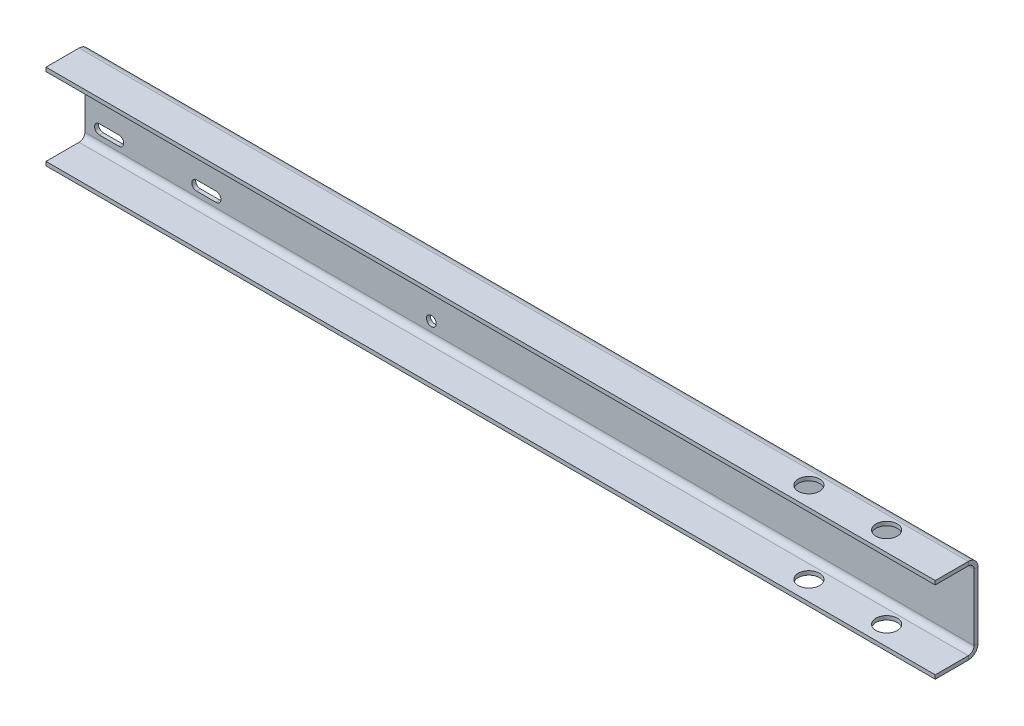
ISO-10303-21;
HEADER;
FILE_DESCRIPTION(('STEP AP214'),'2;1');
FILE_NAME('part.step','',(''),(''),'','','');
FILE_SCHEMA(('AUTOMOTIVE_DESIGN { 1 0 10303 214 1 1 1 1 }'));
ENDSEC;
DATA;
#1=APPLICATION_CONTEXT('core data for automotive mechanical design processes');
#2=APPLICATION_PROTOCOL_DEFINITION('international standard','automotive_design',2000,#1);
#3=PRODUCT_CONTEXT('',#1,'mechanical');
#4=PRODUCT('Part','Part','',(#3));
#5=PRODUCT_RELATED_PRODUCT_CATEGORY('part','',(#4));
#6=PRODUCT_DEFINITION_FORMATION('','',#4);
#7=PRODUCT_DEFINITION_CONTEXT('part definition',#1,'design');
#8=PRODUCT_DEFINITION('design','',#6,#7);
#9=PRODUCT_DEFINITION_SHAPE('','',#8);
#10=(LENGTH_UNIT() NAMED_UNIT(*) SI_UNIT(.MILLI.,.METRE.));
#11=(NAMED_UNIT(*) PLANE_ANGLE_UNIT() SI_UNIT($,.RADIAN.));
#12=(NAMED_UNIT(*) SI_UNIT($,.STERADIAN.) SOLID_ANGLE_UNIT());
#13=UNCERTAINTY_MEASURE_WITH_UNIT(LENGTH_MEASURE(1.E-05),#10,'distance_accuracy_value','');
#14=(GEOMETRIC_REPRESENTATION_CONTEXT(3) GLOBAL_UNCERTAINTY_ASSIGNED_CONTEXT((#13)) GLOBAL_UNIT_ASSIGNED_CONTEXT((#10,
#11,#12)) REPRESENTATION_CONTEXT('',''));
#15=CARTESIAN_POINT('',(0.,0.,0.));
#16=DIRECTION('',(0.,0.,1.));
#17=DIRECTION('',(1.,0.,0.));
#18=AXIS2_PLACEMENT_3D('',#15,#16,#17);
#19=CARTESIAN_POINT('',(0.,0.,-4.));
#20=DIRECTION('',(0.,0.,-1.));
#21=DIRECTION('',(-1.,0.,0.));
#22=AXIS2_PLACEMENT_3D('',#19,#20,#21);
#23=PLANE('',#22);
#24=CARTESIAN_POINT('',(-509.018987341773,19.9999999999998,-4.));
#25=DIRECTION('',(0.,0.,-1.));
#26=DIRECTION('',(-1.,0.,0.));
#27=AXIS2_PLACEMENT_3D('',#24,#25,#26);
#28=CIRCLE('',#27,5.00000000000004);
#29=CARTESIAN_POINT('',(-514.018987341773,19.9999999999998,-4.));
#30=VERTEX_POINT('',#29);
#31=EDGE_CURVE('E880',#30,#30,#28,.T.);
#32=ORIENTED_EDGE('',*,*,#31,.F.);
#33=EDGE_LOOP('',(#32));
#34=FACE_BOUND('',#33,.T.);
#35=CARTESIAN_POINT('',(-750.518987341773,19.9999999999999,-4.));
#36=DIRECTION('',(0.,0.,-1.));
#37=DIRECTION('',(-1.,0.,0.));
#38=AXIS2_PLACEMENT_3D('',#35,#36,#37);
#39=CIRCLE('',#38,5.);
#40=CARTESIAN_POINT('',(-750.518987341773,14.9999999999999,-4.));
#41=VERTEX_POINT('',#40);
#42=CARTESIAN_POINT('',(-750.518987341773,24.9999999999999,-4.));
#43=VERTEX_POINT('',#42);
#44=EDGE_CURVE('E97',#41,#43,#39,.T.);
#45=ORIENTED_EDGE('',*,*,#44,.F.);
#46=DIRECTION('',(-1.,0.,0.));
#47=VECTOR('',#46,1.);
#48=CARTESIAN_POINT('',(-750.518987341773,14.9999999999999,-4.));
#49=LINE('',#48,#47);
#50=CARTESIAN_POINT('',(-730.518987341773,14.9999999999999,-4.));
#51=VERTEX_POINT('',#50);
#52=EDGE_CURVE('E237',#51,#41,#49,.T.);
#53=ORIENTED_EDGE('',*,*,#52,.F.);
#54=CARTESIAN_POINT('',(-730.518987341773,19.9999999999999,-4.));
#55=DIRECTION('',(0.,0.,-1.));
#56=DIRECTION('',(-1.,0.,0.));
#57=AXIS2_PLACEMENT_3D('',#54,#55,#56);
#58=CIRCLE('',#57,5.);
#59=CARTESIAN_POINT('',(-730.518987341773,24.9999999999999,-4.));
#60=VERTEX_POINT('',#59);
#61=EDGE_CURVE('E222',#60,#51,#58,.T.);
#62=ORIENTED_EDGE('',*,*,#61,.F.);
#63=DIRECTION('',(1.,0.,0.));
#64=VECTOR('',#63,1.);
#65=CARTESIAN_POINT('',(-750.518987341773,24.9999999999999,-4.));
#66=LINE('',#65,#64);
#67=EDGE_CURVE('E231',#43,#60,#66,.T.);
#68=ORIENTED_EDGE('',*,*,#67,.F.);
#69=EDGE_LOOP('',(#45,#53,#62,#68));
#70=FACE_BOUND('',#69,.T.);
#71=CARTESIAN_POINT('',(-850.518987341773,19.9999999999999,-4.));
#72=DIRECTION('',(0.,0.,-1.));
#73=DIRECTION('',(-1.,0.,0.));
#74=AXIS2_PLACEMENT_3D('',#71,#72,#73);
#75=CIRCLE('',#74,5.);
#76=CARTESIAN_POINT('',(-850.518987341773,14.9999999999999,-4.));
#77=VERTEX_POINT('',#76);
#78=CARTESIAN_POINT('',(-850.518987341773,24.9999999999999,-4.));
#79=VERTEX_POINT('',#78);
#80=EDGE_CURVE('E244',#77,#79,#75,.T.);
#81=ORIENTED_EDGE('',*,*,#80,.F.);
#82=DIRECTION('',(-1.,0.,0.));
#83=VECTOR('',#82,1.);
#84=CARTESIAN_POINT('',(-850.518987341773,14.9999999999999,-4.));
#85=LINE('',#84,#83);
#86=CARTESIAN_POINT('',(-830.518987341773,14.9999999999999,-4.));
#87=VERTEX_POINT('',#86);
#88=EDGE_CURVE('E254',#87,#77,#85,.T.);
#89=ORIENTED_EDGE('',*,*,#88,.F.);
#90=CARTESIAN_POINT('',(-830.518987341773,19.9999999999999,-4.));
#91=DIRECTION('',(0.,0.,-1.));
#92=DIRECTION('',(-1.,0.,0.));
#93=AXIS2_PLACEMENT_3D('',#90,#91,#92);
#94=CIRCLE('',#93,5.);
#95=CARTESIAN_POINT('',(-830.518987341773,24.9999999999999,-4.));
#96=VERTEX_POINT('',#95);
#97=EDGE_CURVE('E251',#96,#87,#94,.T.);
#98=ORIENTED_EDGE('',*,*,#97,.F.);
#99=DIRECTION('',(1.,0.,0.));
#100=VECTOR('',#99,1.);
#101=CARTESIAN_POINT('',(-850.518987341773,24.9999999999999,-4.));
#102=LINE('',#101,#100);
#103=EDGE_CURVE('E248',#79,#96,#102,.T.);
#104=ORIENTED_EDGE('',*,*,#103,.F.);
#105=EDGE_LOOP('',(#81,#89,#98,#104));
#106=FACE_BOUND('',#105,.T.);
#107=DIRECTION('',(0.,1.,0.));
#108=VECTOR('',#107,1.);
#109=CARTESIAN_POINT('',(49.4810126582273,88.0000000000001,-4.));
#110=LINE('',#109,#108);
#111=CARTESIAN_POINT('',(49.4810126582273,10.,-4.00000000000004));
#112=VERTEX_POINT('',#111);
#113=CARTESIAN_POINT('',(49.4810126582273,78.,-4.));
#114=VERTEX_POINT('',#113);
#115=EDGE_CURVE('E398',#112,#114,#110,.T.);
#116=ORIENTED_EDGE('',*,*,#115,.F.);
#117=DIRECTION('',(1.,0.,0.));
#118=VECTOR('',#117,1.);
#119=CARTESIAN_POINT('',(49.4810126582273,10.,-4.00000000000004));
#120=LINE('',#119,#118);
#121=CARTESIAN_POINT('',(-865.518987341773,10.,-4.));
#122=VERTEX_POINT('',#121);
#123=EDGE_CURVE('E319',#112,#122,#120,.F.);
#124=ORIENTED_EDGE('',*,*,#123,.T.);
#125=DIRECTION('',(0.,-1.,0.));
#126=VECTOR('',#125,1.);
#127=CARTESIAN_POINT('',(-865.518987341773,88.,-4.));
#128=LINE('',#127,#126);
#129=CARTESIAN_POINT('',(-865.518987341773,78.,-4.00000000000008));
#130=VERTEX_POINT('',#129);
#131=EDGE_CURVE('E400',#130,#122,#128,.T.);
#132=ORIENTED_EDGE('',*,*,#131,.F.);
#133=DIRECTION('',(-1.,0.,0.));
#134=VECTOR('',#133,1.);
#135=CARTESIAN_POINT('',(-865.518987341773,78.,-4.00000000000008));
#136=LINE('',#135,#134);
#137=EDGE_CURVE('E374',#130,#114,#136,.F.);
#138=ORIENTED_EDGE('',*,*,#137,.T.);
#139=EDGE_LOOP('',(#116,#124,#132,#138));
#140=FACE_BOUND('',#139,.T.);
#141=ADVANCED_FACE('F81',(#34,#70,#106,#140),#23,.T.);
#142=CARTESIAN_POINT('',(0.,0.,0.));
#143=DIRECTION('',(0.,0.,-1.));
#144=DIRECTION('',(-1.,0.,0.));
#145=AXIS2_PLACEMENT_3D('',#142,#143,#144);
#146=PLANE('',#145);
#147=CARTESIAN_POINT('',(-509.018987341773,19.9999999999998,0.));
#148=DIRECTION('',(0.,0.,-1.));
#149=DIRECTION('',(-1.,0.,0.));
#150=AXIS2_PLACEMENT_3D('',#147,#148,#149);
#151=CIRCLE('',#150,5.00000000000004);
#152=CARTESIAN_POINT('',(-514.018987341773,19.9999999999998,0.));
#153=VERTEX_POINT('',#152);
#154=EDGE_CURVE('E85',#153,#153,#151,.T.);
#155=ORIENTED_EDGE('',*,*,#154,.T.);
#156=EDGE_LOOP('',(#155));
#157=FACE_BOUND('',#156,.T.);
#158=DIRECTION('',(-1.,0.,0.));
#159=VECTOR('',#158,1.);
#160=CARTESIAN_POINT('',(0.,14.9999999999999,0.));
#161=LINE('',#160,#159);
#162=CARTESIAN_POINT('',(-730.518987341773,14.9999999999999,0.));
#163=VERTEX_POINT('',#162);
#164=CARTESIAN_POINT('',(-750.518987341773,14.9999999999999,0.));
#165=VERTEX_POINT('',#164);
#166=EDGE_CURVE('E90',#163,#165,#161,.T.);
#167=ORIENTED_EDGE('',*,*,#166,.T.);
#168=CARTESIAN_POINT('',(-750.518987341773,19.9999999999999,0.));
#169=DIRECTION('',(0.,0.,-1.));
#170=DIRECTION('',(-1.,0.,0.));
#171=AXIS2_PLACEMENT_3D('',#168,#169,#170);
#172=CIRCLE('',#171,5.);
#173=CARTESIAN_POINT('',(-750.518987341773,24.9999999999999,0.));
#174=VERTEX_POINT('',#173);
#175=EDGE_CURVE('E13',#165,#174,#172,.T.);
#176=ORIENTED_EDGE('',*,*,#175,.T.);
#177=DIRECTION('',(1.,0.,0.));
#178=VECTOR('',#177,1.);
#179=CARTESIAN_POINT('',(0.,24.9999999999999,0.));
#180=LINE('',#179,#178);
#181=CARTESIAN_POINT('',(-730.518987341773,24.9999999999999,0.));
#182=VERTEX_POINT('',#181);
#183=EDGE_CURVE('E423',#174,#182,#180,.T.);
#184=ORIENTED_EDGE('',*,*,#183,.T.);
#185=CARTESIAN_POINT('',(-730.518987341773,19.9999999999999,0.));
#186=DIRECTION('',(0.,0.,-1.));
#187=DIRECTION('',(-1.,0.,0.));
#188=AXIS2_PLACEMENT_3D('',#185,#186,#187);
#189=CIRCLE('',#188,5.);
#190=EDGE_CURVE('E225',#182,#163,#189,.T.);
#191=ORIENTED_EDGE('',*,*,#190,.T.);
#192=EDGE_LOOP('',(#167,#176,#184,#191));
#193=FACE_BOUND('',#192,.T.);
#194=DIRECTION('',(-1.,0.,0.));
#195=VECTOR('',#194,1.);
#196=CARTESIAN_POINT('',(0.,14.9999999999999,0.));
#197=LINE('',#196,#195);
#198=CARTESIAN_POINT('',(-830.518987341773,14.9999999999999,0.));
#199=VERTEX_POINT('',#198);
#200=CARTESIAN_POINT('',(-850.518987341773,14.9999999999999,0.));
#201=VERTEX_POINT('',#200);
#202=EDGE_CURVE('E417',#199,#201,#197,.T.);
#203=ORIENTED_EDGE('',*,*,#202,.T.);
#204=CARTESIAN_POINT('',(-850.518987341773,19.9999999999999,0.));
#205=DIRECTION('',(0.,0.,-1.));
#206=DIRECTION('',(-1.,0.,0.));
#207=AXIS2_PLACEMENT_3D('',#204,#205,#206);
#208=CIRCLE('',#207,5.);
#209=CARTESIAN_POINT('',(-850.518987341773,24.9999999999999,0.));
#210=VERTEX_POINT('',#209);
#211=EDGE_CURVE('E420',#201,#210,#208,.T.);
#212=ORIENTED_EDGE('',*,*,#211,.T.);
#213=DIRECTION('',(1.,0.,0.));
#214=VECTOR('',#213,1.);
#215=CARTESIAN_POINT('',(0.,24.9999999999999,0.));
#216=LINE('',#215,#214);
#217=CARTESIAN_POINT('',(-830.518987341773,24.9999999999999,0.));
#218=VERTEX_POINT('',#217);
#219=EDGE_CURVE('E404',#210,#218,#216,.T.);
#220=ORIENTED_EDGE('',*,*,#219,.T.);
#221=CARTESIAN_POINT('',(-830.518987341773,19.9999999999999,0.));
#222=DIRECTION('',(0.,0.,-1.));
#223=DIRECTION('',(-1.,0.,0.));
#224=AXIS2_PLACEMENT_3D('',#221,#222,#223);
#225=CIRCLE('',#224,5.);
#226=EDGE_CURVE('E414',#218,#199,#225,.T.);
#227=ORIENTED_EDGE('',*,*,#226,.T.);
#228=EDGE_LOOP('',(#203,#212,#220,#227));
#229=FACE_BOUND('',#228,.T.);
#230=DIRECTION('',(1.,0.,0.));
#231=VECTOR('',#230,1.);
#232=CARTESIAN_POINT('',(49.4810126582273,9.99999999999998,0.));
#233=LINE('',#232,#231);
#234=CARTESIAN_POINT('',(49.4810126582273,9.99999999999998,0.));
#235=VERTEX_POINT('',#234);
#236=CARTESIAN_POINT('',(-865.518987341773,9.99999999999998,0.));
#237=VERTEX_POINT('',#236);
#238=EDGE_CURVE('E332',#235,#237,#233,.F.);
#239=ORIENTED_EDGE('',*,*,#238,.F.);
#240=DIRECTION('',(0.,1.,0.));
#241=VECTOR('',#240,1.);
#242=CARTESIAN_POINT('',(49.4810126582273,88.0000000000001,0.));
#243=LINE('',#242,#241);
#244=CARTESIAN_POINT('',(49.4810126582273,78.,0.));
#245=VERTEX_POINT('',#244);
#246=EDGE_CURVE('E395',#235,#245,#243,.T.);
#247=ORIENTED_EDGE('',*,*,#246,.T.);
#248=DIRECTION('',(-1.,0.,0.));
#249=VECTOR('',#248,1.);
#250=CARTESIAN_POINT('',(-865.518987341773,78.,0.));
#251=LINE('',#250,#249);
#252=CARTESIAN_POINT('',(-865.518987341773,78.,0.));
#253=VERTEX_POINT('',#252);
#254=EDGE_CURVE('E387',#253,#245,#251,.F.);
#255=ORIENTED_EDGE('',*,*,#254,.F.);
#256=DIRECTION('',(0.,-1.,0.));
#257=VECTOR('',#256,1.);
#258=CARTESIAN_POINT('',(-865.518987341773,88.,0.));
#259=LINE('',#258,#257);
#260=EDGE_CURVE('E401',#253,#237,#259,.T.);
#261=ORIENTED_EDGE('',*,*,#260,.T.);
#262=EDGE_LOOP('',(#239,#247,#255,#261));
#263=FACE_BOUND('',#262,.T.);
#264=ADVANCED_FACE('F428',(#157,#193,#229,#263),#146,.F.);
#265=CARTESIAN_POINT('',(49.4810126582273,88.0000000000001,-4.));
#266=DIRECTION('',(1.,0.,0.));
#267=DIRECTION('',(0.,0.,-1.));
#268=AXIS2_PLACEMENT_3D('',#265,#266,#267);
#269=PLANE('',#268);
#270=ORIENTED_EDGE('',*,*,#246,.F.);
#271=DIRECTION('',(0.,0.,-1.));
#272=VECTOR('',#271,1.);
#273=CARTESIAN_POINT('',(49.4810126582273,9.99999999999998,0.));
#274=LINE('',#273,#272);
#275=EDGE_CURVE('E326',#235,#112,#274,.T.);
#276=ORIENTED_EDGE('',*,*,#275,.T.);
#277=ORIENTED_EDGE('',*,*,#115,.T.);
#278=DIRECTION('',(0.,0.,-1.));
#279=VECTOR('',#278,1.);
#280=CARTESIAN_POINT('',(49.4810126582273,78.,0.));
#281=LINE('',#280,#279);
#282=EDGE_CURVE('E392',#245,#114,#281,.T.);
#283=ORIENTED_EDGE('',*,*,#282,.F.);
#284=EDGE_LOOP('',(#270,#276,#277,#283));
#285=FACE_BOUND('',#284,.T.);
#286=ADVANCED_FACE('F83',(#285),#269,.T.);
#287=CARTESIAN_POINT('',(-865.518987341773,88.,-4.));
#288=DIRECTION('',(-1.,0.,0.));
#289=DIRECTION('',(0.,0.,1.));
#290=AXIS2_PLACEMENT_3D('',#287,#288,#289);
#291=PLANE('',#290);
#292=DIRECTION('',(0.,0.,-1.));
#293=VECTOR('',#292,1.);
#294=CARTESIAN_POINT('',(-865.518987341773,9.99999999999998,0.));
#295=LINE('',#294,#293);
#296=EDGE_CURVE('E336',#237,#122,#295,.T.);
#297=ORIENTED_EDGE('',*,*,#296,.F.);
#298=ORIENTED_EDGE('',*,*,#260,.F.);
#299=DIRECTION('',(0.,0.,-1.));
#300=VECTOR('',#299,1.);
#301=CARTESIAN_POINT('',(-865.518987341773,78.,0.));
#302=LINE('',#301,#300);
#303=EDGE_CURVE('E381',#253,#130,#302,.T.);
#304=ORIENTED_EDGE('',*,*,#303,.T.);
#305=ORIENTED_EDGE('',*,*,#131,.T.);
#306=EDGE_LOOP('',(#297,#298,#304,#305));
#307=FACE_BOUND('',#306,.T.);
#308=ADVANCED_FACE('F459',(#307),#291,.T.);
#309=CARTESIAN_POINT('',(49.4810126582273,78.0000000000001,5.99999999999999));
#310=DIRECTION('',(1.,0.,0.));
#311=DIRECTION('',(0.,0.,-1.));
#312=AXIS2_PLACEMENT_3D('',#309,#310,#311);
#313=PLANE('',#312);
#314=DIRECTION('',(0.,1.,0.));
#315=VECTOR('',#314,1.);
#316=CARTESIAN_POINT('',(49.4810126582273,88.0000000000001,5.99999999999996));
#317=LINE('',#316,#315);
#318=CARTESIAN_POINT('',(49.4810126582273,84.0000000000001,5.99999999999997));
#319=VERTEX_POINT('',#318);
#320=CARTESIAN_POINT('',(49.4810126582273,88.0000000000001,5.99999999999995));
#321=VERTEX_POINT('',#320);
#322=EDGE_CURVE('E339',#319,#321,#317,.T.);
#323=ORIENTED_EDGE('',*,*,#322,.F.);
#324=CARTESIAN_POINT('',(49.4810126582273,78.0000000000001,5.99999999999999));
#325=DIRECTION('',(-1.,0.,0.));
#326=DIRECTION('',(0.,0.,1.));
#327=AXIS2_PLACEMENT_3D('',#324,#325,#326);
#328=CIRCLE('',#327,6.00000000000007);
#329=EDGE_CURVE('E384',#245,#319,#328,.F.);
#330=ORIENTED_EDGE('',*,*,#329,.F.);
#331=ORIENTED_EDGE('',*,*,#282,.T.);
#332=CARTESIAN_POINT('',(49.4810126582273,78.0000000000001,5.99999999999999));
#333=DIRECTION('',(-1.,0.,0.));
#334=DIRECTION('',(0.,0.,1.));
#335=AXIS2_PLACEMENT_3D('',#332,#333,#334);
#336=CIRCLE('',#335,10.0000000000001);
#337=EDGE_CURVE('E377',#114,#321,#336,.F.);
#338=ORIENTED_EDGE('',*,*,#337,.T.);
#339=EDGE_LOOP('',(#323,#330,#331,#338));
#340=FACE_BOUND('',#339,.T.);
#341=ADVANCED_FACE('F461',(#340),#313,.T.);
#342=CARTESIAN_POINT('',(-865.518987341773,78.0000000000001,5.99999999999999));
#343=DIRECTION('',(1.,0.,0.));
#344=DIRECTION('',(0.,0.,-1.));
#345=AXIS2_PLACEMENT_3D('',#342,#343,#344);
#346=PLANE('',#345);
#347=CARTESIAN_POINT('',(-865.518987341773,78.0000000000001,5.99999999999999));
#348=DIRECTION('',(-1.,0.,0.));
#349=DIRECTION('',(0.,0.,1.));
#350=AXIS2_PLACEMENT_3D('',#347,#348,#349);
#351=CIRCLE('',#350,6.00000000000007);
#352=CARTESIAN_POINT('',(-865.518987341773,84.0000000000001,5.99999999999997));
#353=VERTEX_POINT('',#352);
#354=EDGE_CURVE('E344',#353,#253,#351,.T.);
#355=ORIENTED_EDGE('',*,*,#354,.F.);
#356=DIRECTION('',(0.,1.,0.));
#357=VECTOR('',#356,1.);
#358=CARTESIAN_POINT('',(-865.518987341773,84.,5.99999999999996));
#359=LINE('',#358,#357);
#360=CARTESIAN_POINT('',(-865.518987341773,88.,5.99999999999995));
#361=VERTEX_POINT('',#360);
#362=EDGE_CURVE('E367',#353,#361,#359,.T.);
#363=ORIENTED_EDGE('',*,*,#362,.T.);
#364=CARTESIAN_POINT('',(-865.518987341773,78.0000000000001,5.99999999999999));
#365=DIRECTION('',(-1.,0.,0.));
#366=DIRECTION('',(0.,0.,1.));
#367=AXIS2_PLACEMENT_3D('',#364,#365,#366);
#368=CIRCLE('',#367,10.0000000000001);
#369=EDGE_CURVE('E378',#361,#130,#368,.T.);
#370=ORIENTED_EDGE('',*,*,#369,.T.);
#371=ORIENTED_EDGE('',*,*,#303,.F.);
#372=EDGE_LOOP('',(#355,#363,#370,#371));
#373=FACE_BOUND('',#372,.T.);
#374=ADVANCED_FACE('F457',(#373),#346,.F.);
#375=CARTESIAN_POINT('',(-865.518987341773,78.0000000000001,5.99999999999999));
#376=DIRECTION('',(-1.,0.,0.));
#377=DIRECTION('',(0.,1.,0.));
#378=AXIS2_PLACEMENT_3D('',#375,#376,#377);
#379=CYLINDRICAL_SURFACE('',#378,10.0000000000001);
#380=ORIENTED_EDGE('',*,*,#137,.F.);
#381=ORIENTED_EDGE('',*,*,#369,.F.);
#382=DIRECTION('',(-1.,0.,0.));
#383=VECTOR('',#382,1.);
#384=CARTESIAN_POINT('',(0.,88.0000000000001,5.99999999999996));
#385=LINE('',#384,#383);
#386=EDGE_CURVE('E364',#321,#361,#385,.T.);
#387=ORIENTED_EDGE('',*,*,#386,.F.);
#388=ORIENTED_EDGE('',*,*,#337,.F.);
#389=EDGE_LOOP('',(#380,#381,#387,#388));
#390=FACE_BOUND('',#389,.T.);
#391=ADVANCED_FACE('F488',(#390),#379,.T.);
#392=CARTESIAN_POINT('',(-865.518987341773,78.0000000000001,5.99999999999999));
#393=DIRECTION('',(-1.,0.,0.));
#394=DIRECTION('',(0.,1.,0.));
#395=AXIS2_PLACEMENT_3D('',#392,#393,#394);
#396=CYLINDRICAL_SURFACE('',#395,6.00000000000007);
#397=ORIENTED_EDGE('',*,*,#254,.T.);
#398=ORIENTED_EDGE('',*,*,#329,.T.);
#399=DIRECTION('',(1.,0.,0.));
#400=VECTOR('',#399,1.);
#401=CARTESIAN_POINT('',(49.4810126582273,84.0000000000001,5.99999999999998));
#402=LINE('',#401,#400);
#403=EDGE_CURVE('E370',#319,#353,#402,.F.);
#404=ORIENTED_EDGE('',*,*,#403,.T.);
#405=ORIENTED_EDGE('',*,*,#354,.T.);
#406=EDGE_LOOP('',(#397,#398,#404,#405));
#407=FACE_BOUND('',#406,.T.);
#408=ADVANCED_FACE('F480',(#407),#396,.F.);
#409=CARTESIAN_POINT('',(-865.518987341773,88.,0.));
#410=DIRECTION('',(-1.,0.,0.));
#411=DIRECTION('',(0.,-1.,0.));
#412=AXIS2_PLACEMENT_3D('',#409,#410,#411);
#413=PLANE('',#412);
#414=DIRECTION('',(0.,0.,-1.));
#415=VECTOR('',#414,1.);
#416=CARTESIAN_POINT('',(-865.518987341773,88.,0.));
#417=LINE('',#416,#415);
#418=CARTESIAN_POINT('',(-865.518987341773,88.0000000000001,40.));
#419=VERTEX_POINT('',#418);
#420=EDGE_CURVE('E348',#419,#361,#417,.T.);
#421=ORIENTED_EDGE('',*,*,#420,.T.);
#422=ORIENTED_EDGE('',*,*,#362,.F.);
#423=DIRECTION('',(0.,0.,1.));
#424=VECTOR('',#423,1.);
#425=CARTESIAN_POINT('',(-865.518987341773,84.,-3.3584246494911E-13));
#426=LINE('',#425,#424);
#427=CARTESIAN_POINT('',(-865.518987341773,84.0000000000002,40.));
#428=VERTEX_POINT('',#427);
#429=EDGE_CURVE('E356',#428,#353,#426,.F.);
#430=ORIENTED_EDGE('',*,*,#429,.F.);
#431=DIRECTION('',(0.,-1.,0.));
#432=VECTOR('',#431,1.);
#433=CARTESIAN_POINT('',(-865.518987341773,88.0000000000001,40.));
#434=LINE('',#433,#432);
#435=EDGE_CURVE('E342',#419,#428,#434,.T.);
#436=ORIENTED_EDGE('',*,*,#435,.F.);
#437=EDGE_LOOP('',(#421,#422,#430,#436));
#438=FACE_BOUND('',#437,.T.);
#439=ADVANCED_FACE('F506',(#438),#413,.T.);
#440=CARTESIAN_POINT('',(49.4810126582273,88.0000000000003,40.));
#441=DIRECTION('',(1.,0.,0.));
#442=DIRECTION('',(0.,0.,-1.));
#443=AXIS2_PLACEMENT_3D('',#440,#441,#442);
#444=PLANE('',#443);
#445=DIRECTION('',(0.,0.,-1.));
#446=VECTOR('',#445,1.);
#447=CARTESIAN_POINT('',(49.4810126582273,84.0000000000001,-3.18675290094444E-13));
#448=LINE('',#447,#446);
#449=CARTESIAN_POINT('',(49.4810126582273,84.0000000000003,40.));
#450=VERTEX_POINT('',#449);
#451=EDGE_CURVE('E362',#319,#450,#448,.F.);
#452=ORIENTED_EDGE('',*,*,#451,.F.);
#453=ORIENTED_EDGE('',*,*,#322,.T.);
#454=DIRECTION('',(0.,0.,1.));
#455=VECTOR('',#454,1.);
#456=CARTESIAN_POINT('',(49.4810126582273,88.0000000000003,40.));
#457=LINE('',#456,#455);
#458=CARTESIAN_POINT('',(49.4810126582273,88.0000000000003,40.));
#459=VERTEX_POINT('',#458);
#460=EDGE_CURVE('E354',#321,#459,#457,.T.);
#461=ORIENTED_EDGE('',*,*,#460,.T.);
#462=DIRECTION('',(0.,-1.,0.));
#463=VECTOR('',#462,1.);
#464=CARTESIAN_POINT('',(49.4810126582273,88.0000000000003,40.));
#465=LINE('',#464,#463);
#466=EDGE_CURVE('E345',#459,#450,#465,.T.);
#467=ORIENTED_EDGE('',*,*,#466,.T.);
#468=EDGE_LOOP('',(#452,#453,#461,#467));
#469=FACE_BOUND('',#468,.T.);
#470=ADVANCED_FACE('F492',(#469),#444,.T.);
#471=CARTESIAN_POINT('',(0.,88.0000000000001,-3.49808390304483E-13));
#472=DIRECTION('',(0.,1.,0.));
#473=DIRECTION('',(0.,0.,1.));
#474=AXIS2_PLACEMENT_3D('',#471,#472,#473);
#475=PLANE('',#474);
#476=CARTESIAN_POINT('',(-20.5189873417727,88.0000000000005,20.0000000000003));
#477=DIRECTION('',(0.,-1.,0.));
#478=DIRECTION('',(0.,0.,-1.));
#479=AXIS2_PLACEMENT_3D('',#476,#477,#478);
#480=CIRCLE('',#479,11.);
#481=CARTESIAN_POINT('',(-20.5189873417727,88.0000000000005,9.00000000000031));
#482=VERTEX_POINT('',#481);
#483=EDGE_CURVE('E260',#482,#482,#480,.T.);
#484=ORIENTED_EDGE('',*,*,#483,.T.);
#485=EDGE_LOOP('',(#484));
#486=FACE_BOUND('',#485,.T.);
#487=CARTESIAN_POINT('',(-100.518987341773,88.0000000000004,20.0000000000003));
#488=DIRECTION('',(0.,-1.,0.));
#489=DIRECTION('',(0.,0.,-1.));
#490=AXIS2_PLACEMENT_3D('',#487,#488,#489);
#491=CIRCLE('',#490,11.);
#492=CARTESIAN_POINT('',(-100.518987341773,88.0000000000005,9.00000000000028));
#493=VERTEX_POINT('',#492);
#494=EDGE_CURVE('E276',#493,#493,#491,.T.);
#495=ORIENTED_EDGE('',*,*,#494,.T.);
#496=EDGE_LOOP('',(#495));
#497=FACE_BOUND('',#496,.T.);
#498=ORIENTED_EDGE('',*,*,#460,.F.);
#499=ORIENTED_EDGE('',*,*,#386,.T.);
#500=ORIENTED_EDGE('',*,*,#420,.F.);
#501=DIRECTION('',(-1.,0.,0.));
#502=VECTOR('',#501,1.);
#503=CARTESIAN_POINT('',(-865.518987341773,88.0000000000001,40.));
#504=LINE('',#503,#502);
#505=EDGE_CURVE('E351',#459,#419,#504,.T.);
#506=ORIENTED_EDGE('',*,*,#505,.F.);
#507=EDGE_LOOP('',(#498,#499,#500,#506));
#508=FACE_BOUND('',#507,.T.);
#509=ADVANCED_FACE('F496',(#486,#497,#508),#475,.T.);
#510=CARTESIAN_POINT('',(0.,84.0000000000001,-3.3584246494911E-13));
#511=DIRECTION('',(0.,1.,0.));
#512=DIRECTION('',(0.,0.,1.));
#513=AXIS2_PLACEMENT_3D('',#510,#511,#512);
#514=PLANE('',#513);
#515=CARTESIAN_POINT('',(-20.5189873417727,84.0000000000002,20.0000000000003));
#516=DIRECTION('',(0.,1.,0.));
#517=DIRECTION('',(0.,0.,1.));
#518=AXIS2_PLACEMENT_3D('',#515,#516,#517);
#519=CIRCLE('',#518,11.);
#520=CARTESIAN_POINT('',(-20.5189873417727,84.0000000000002,31.0000000000003));
#521=VERTEX_POINT('',#520);
#522=EDGE_CURVE('E273',#521,#521,#519,.T.);
#523=ORIENTED_EDGE('',*,*,#522,.T.);
#524=EDGE_LOOP('',(#523));
#525=FACE_BOUND('',#524,.T.);
#526=CARTESIAN_POINT('',(-100.518987341773,84.0000000000002,20.0000000000003));
#527=DIRECTION('',(0.,1.,0.));
#528=DIRECTION('',(0.,0.,1.));
#529=AXIS2_PLACEMENT_3D('',#526,#527,#528);
#530=CIRCLE('',#529,11.);
#531=CARTESIAN_POINT('',(-100.518987341773,84.0000000000002,31.0000000000003));
#532=VERTEX_POINT('',#531);
#533=EDGE_CURVE('E283',#532,#532,#530,.T.);
#534=ORIENTED_EDGE('',*,*,#533,.T.);
#535=EDGE_LOOP('',(#534));
#536=FACE_BOUND('',#535,.T.);
#537=ORIENTED_EDGE('',*,*,#403,.F.);
#538=ORIENTED_EDGE('',*,*,#451,.T.);
#539=DIRECTION('',(1.,0.,0.));
#540=VECTOR('',#539,1.);
#541=CARTESIAN_POINT('',(0.,84.0000000000003,40.));
#542=LINE('',#541,#540);
#543=EDGE_CURVE('E359',#450,#428,#542,.F.);
#544=ORIENTED_EDGE('',*,*,#543,.T.);
#545=ORIENTED_EDGE('',*,*,#429,.T.);
#546=EDGE_LOOP('',(#537,#538,#544,#545));
#547=FACE_BOUND('',#546,.T.);
#548=ADVANCED_FACE('F503',(#525,#536,#547),#514,.F.);
#549=CARTESIAN_POINT('',(-865.518987341773,88.0000000000001,40.));
#550=DIRECTION('',(0.,0.,1.));
#551=DIRECTION('',(0.,-1.,0.));
#552=AXIS2_PLACEMENT_3D('',#549,#550,#551);
#553=PLANE('',#552);
#554=ORIENTED_EDGE('',*,*,#543,.F.);
#555=ORIENTED_EDGE('',*,*,#466,.F.);
#556=ORIENTED_EDGE('',*,*,#505,.T.);
#557=ORIENTED_EDGE('',*,*,#435,.T.);
#558=EDGE_LOOP('',(#554,#555,#556,#557));
#559=FACE_BOUND('',#558,.T.);
#560=ADVANCED_FACE('F500',(#559),#553,.T.);
#561=CARTESIAN_POINT('',(-865.518987341773,9.99999999999993,6.00000000000001));
#562=DIRECTION('',(-1.,0.,0.));
#563=DIRECTION('',(0.,0.,1.));
#564=AXIS2_PLACEMENT_3D('',#561,#562,#563);
#565=PLANE('',#564);
#566=DIRECTION('',(0.,-1.,0.));
#567=VECTOR('',#566,1.);
#568=CARTESIAN_POINT('',(-865.518987341773,-1.26753006330052E-13,5.99999999999996));
#569=LINE('',#568,#567);
#570=CARTESIAN_POINT('',(-865.518987341773,3.99999999999987,5.99999999999999));
#571=VERTEX_POINT('',#570);
#572=CARTESIAN_POINT('',(-865.518987341773,-1.26634813746307E-13,5.99999999999998));
#573=VERTEX_POINT('',#572);
#574=EDGE_CURVE('E286',#571,#573,#569,.T.);
#575=ORIENTED_EDGE('',*,*,#574,.F.);
#576=CARTESIAN_POINT('',(-865.518987341773,9.99999999999993,6.00000000000001));
#577=DIRECTION('',(1.,0.,0.));
#578=DIRECTION('',(0.,0.,-1.));
#579=AXIS2_PLACEMENT_3D('',#576,#577,#578);
#580=CIRCLE('',#579,6.00000000000006);
#581=EDGE_CURVE('E329',#237,#571,#580,.F.);
#582=ORIENTED_EDGE('',*,*,#581,.F.);
#583=ORIENTED_EDGE('',*,*,#296,.T.);
#584=CARTESIAN_POINT('',(-865.518987341773,9.99999999999993,6.00000000000001));
#585=DIRECTION('',(1.,0.,0.));
#586=DIRECTION('',(0.,0.,-1.));
#587=AXIS2_PLACEMENT_3D('',#584,#585,#586);
#588=CIRCLE('',#587,10.0000000000001);
#589=EDGE_CURVE('E322',#122,#573,#588,.F.);
#590=ORIENTED_EDGE('',*,*,#589,.T.);
#591=EDGE_LOOP('',(#575,#582,#583,#590));
#592=FACE_BOUND('',#591,.T.);
#593=ADVANCED_FACE('F529',(#592),#565,.T.);
#594=CARTESIAN_POINT('',(49.4810126582273,9.99999999999993,6.00000000000001));
#595=DIRECTION('',(-1.,0.,0.));
#596=DIRECTION('',(0.,0.,1.));
#597=AXIS2_PLACEMENT_3D('',#594,#595,#596);
#598=PLANE('',#597);
#599=CARTESIAN_POINT('',(49.4810126582273,9.99999999999993,6.00000000000001));
#600=DIRECTION('',(1.,0.,0.));
#601=DIRECTION('',(0.,0.,-1.));
#602=AXIS2_PLACEMENT_3D('',#599,#600,#601);
#603=CIRCLE('',#602,6.00000000000006);
#604=CARTESIAN_POINT('',(49.4810126582273,3.99999999999987,5.99999999999999));
#605=VERTEX_POINT('',#604);
#606=EDGE_CURVE('E289',#605,#235,#603,.T.);
#607=ORIENTED_EDGE('',*,*,#606,.F.);
#608=DIRECTION('',(0.,-1.,0.));
#609=VECTOR('',#608,1.);
#610=CARTESIAN_POINT('',(49.4810126582273,3.99999999999999,6.00000000000001));
#611=LINE('',#610,#609);
#612=CARTESIAN_POINT('',(49.4810126582273,0.,5.99999999999999));
#613=VERTEX_POINT('',#612);
#614=EDGE_CURVE('E312',#605,#613,#611,.T.);
#615=ORIENTED_EDGE('',*,*,#614,.T.);
#616=CARTESIAN_POINT('',(49.4810126582273,9.99999999999993,6.00000000000001));
#617=DIRECTION('',(1.,0.,0.));
#618=DIRECTION('',(0.,0.,-1.));
#619=AXIS2_PLACEMENT_3D('',#616,#617,#618);
#620=CIRCLE('',#619,10.0000000000001);
#621=EDGE_CURVE('E323',#613,#112,#620,.T.);
#622=ORIENTED_EDGE('',*,*,#621,.T.);
#623=ORIENTED_EDGE('',*,*,#275,.F.);
#624=EDGE_LOOP('',(#607,#615,#622,#623));
#625=FACE_BOUND('',#624,.T.);
#626=ADVANCED_FACE('F512',(#625),#598,.F.);
#627=CARTESIAN_POINT('',(49.4810126582273,9.99999999999993,6.00000000000001));
#628=DIRECTION('',(1.,0.,0.));
#629=DIRECTION('',(0.,-1.,0.));
#630=AXIS2_PLACEMENT_3D('',#627,#628,#629);
#631=CYLINDRICAL_SURFACE('',#630,10.0000000000001);
#632=ORIENTED_EDGE('',*,*,#123,.F.);
#633=ORIENTED_EDGE('',*,*,#621,.F.);
#634=DIRECTION('',(1.,0.,0.));
#635=VECTOR('',#634,1.);
#636=CARTESIAN_POINT('',(0.,0.,5.99999999999999));
#637=LINE('',#636,#635);
#638=EDGE_CURVE('E309',#573,#613,#637,.T.);
#639=ORIENTED_EDGE('',*,*,#638,.F.);
#640=ORIENTED_EDGE('',*,*,#589,.F.);
#641=EDGE_LOOP('',(#632,#633,#639,#640));
#642=FACE_BOUND('',#641,.T.);
#643=ADVANCED_FACE('F509',(#642),#631,.T.);
#644=CARTESIAN_POINT('',(49.4810126582273,9.99999999999993,6.00000000000001));
#645=DIRECTION('',(1.,0.,0.));
#646=DIRECTION('',(0.,-1.,0.));
#647=AXIS2_PLACEMENT_3D('',#644,#645,#646);
#648=CYLINDRICAL_SURFACE('',#647,6.00000000000006);
#649=ORIENTED_EDGE('',*,*,#238,.T.);
#650=ORIENTED_EDGE('',*,*,#581,.T.);
#651=DIRECTION('',(-1.,0.,0.));
#652=VECTOR('',#651,1.);
#653=CARTESIAN_POINT('',(-865.518987341773,3.99999999999987,5.99999999999998));
#654=LINE('',#653,#652);
#655=EDGE_CURVE('E315',#571,#605,#654,.F.);
#656=ORIENTED_EDGE('',*,*,#655,.T.);
#657=ORIENTED_EDGE('',*,*,#606,.T.);
#658=EDGE_LOOP('',(#649,#650,#656,#657));
#659=FACE_BOUND('',#658,.T.);
#660=ADVANCED_FACE('F532',(#659),#648,.F.);
#661=CARTESIAN_POINT('',(49.4810126582273,0.,0.));
#662=DIRECTION('',(1.,0.,0.));
#663=DIRECTION('',(0.,1.,0.));
#664=AXIS2_PLACEMENT_3D('',#661,#662,#663);
#665=PLANE('',#664);
#666=DIRECTION('',(0.,0.,-1.));
#667=VECTOR('',#666,1.);
#668=CARTESIAN_POINT('',(49.4810126582273,0.,0.));
#669=LINE('',#668,#667);
#670=CARTESIAN_POINT('',(49.4810126582273,-1.33599577176679E-13,40.));
#671=VERTEX_POINT('',#670);
#672=EDGE_CURVE('E293',#671,#613,#669,.T.);
#673=ORIENTED_EDGE('',*,*,#672,.T.);
#674=ORIENTED_EDGE('',*,*,#614,.F.);
#675=DIRECTION('',(0.,0.,1.));
#676=VECTOR('',#675,1.);
#677=CARTESIAN_POINT('',(49.4810126582273,4.00000000000001,0.));
#678=LINE('',#677,#676);
#679=CARTESIAN_POINT('',(49.4810126582273,3.99999999999987,40.));
#680=VERTEX_POINT('',#679);
#681=EDGE_CURVE('E301',#680,#605,#678,.F.);
#682=ORIENTED_EDGE('',*,*,#681,.F.);
#683=DIRECTION('',(0.,1.,0.));
#684=VECTOR('',#683,1.);
#685=CARTESIAN_POINT('',(49.4810126582273,-1.33573707650214E-13,40.));
#686=LINE('',#685,#684);
#687=EDGE_CURVE('E287',#671,#680,#686,.T.);
#688=ORIENTED_EDGE('',*,*,#687,.F.);
#689=EDGE_LOOP('',(#673,#674,#682,#688));
#690=FACE_BOUND('',#689,.T.);
#691=ADVANCED_FACE('F521',(#690),#665,.T.);
#692=CARTESIAN_POINT('',(-865.518987341773,-2.45463371850718E-13,40.));
#693=DIRECTION('',(-1.,0.,0.));
#694=DIRECTION('',(0.,-1.,0.));
#695=AXIS2_PLACEMENT_3D('',#692,#693,#694);
#696=PLANE('',#695);
#697=DIRECTION('',(0.,0.,-1.));
#698=VECTOR('',#697,1.);
#699=CARTESIAN_POINT('',(-865.518987341773,3.99999999999989,0.));
#700=LINE('',#699,#698);
#701=CARTESIAN_POINT('',(-865.518987341773,3.99999999999975,40.));
#702=VERTEX_POINT('',#701);
#703=EDGE_CURVE('E307',#571,#702,#700,.F.);
#704=ORIENTED_EDGE('',*,*,#703,.F.);
#705=ORIENTED_EDGE('',*,*,#574,.T.);
#706=DIRECTION('',(0.,0.,1.));
#707=VECTOR('',#706,1.);
#708=CARTESIAN_POINT('',(-865.518987341773,-2.45654759298661E-13,40.));
#709=LINE('',#708,#707);
#710=CARTESIAN_POINT('',(-865.518987341773,-2.45654759298661E-13,40.));
#711=VERTEX_POINT('',#710);
#712=EDGE_CURVE('E299',#573,#711,#709,.T.);
#713=ORIENTED_EDGE('',*,*,#712,.T.);
#714=DIRECTION('',(0.,1.,0.));
#715=VECTOR('',#714,1.);
#716=CARTESIAN_POINT('',(-865.518987341773,-2.45463371850718E-13,40.));
#717=LINE('',#716,#715);
#718=EDGE_CURVE('E290',#711,#702,#717,.T.);
#719=ORIENTED_EDGE('',*,*,#718,.T.);
#720=EDGE_LOOP('',(#704,#705,#713,#719));
#721=FACE_BOUND('',#720,.T.);
#722=ADVANCED_FACE('F528',(#721),#696,.T.);
#723=CARTESIAN_POINT('',(0.,0.,0.));
#724=DIRECTION('',(0.,-1.,0.));
#725=DIRECTION('',(0.,0.,-1.));
#726=AXIS2_PLACEMENT_3D('',#723,#724,#725);
#727=PLANE('',#726);
#728=CARTESIAN_POINT('',(-20.5189873417727,0.,20.));
#729=DIRECTION('',(0.,-1.,0.));
#730=DIRECTION('',(0.,0.,-1.));
#731=AXIS2_PLACEMENT_3D('',#728,#729,#730);
#732=CIRCLE('',#731,11.);
#733=CARTESIAN_POINT('',(-20.5189873417727,0.,9.));
#734=VERTEX_POINT('',#733);
#735=EDGE_CURVE('E270',#734,#734,#732,.T.);
#736=ORIENTED_EDGE('',*,*,#735,.F.);
#737=EDGE_LOOP('',(#736));
#738=FACE_BOUND('',#737,.T.);
#739=CARTESIAN_POINT('',(-100.518987341773,0.,20.));
#740=DIRECTION('',(0.,-1.,0.));
#741=DIRECTION('',(0.,0.,-1.));
#742=AXIS2_PLACEMENT_3D('',#739,#740,#741);
#743=CIRCLE('',#742,11.);
#744=CARTESIAN_POINT('',(-100.518987341773,0.,8.99999999999997));
#745=VERTEX_POINT('',#744);
#746=EDGE_CURVE('E280',#745,#745,#743,.T.);
#747=ORIENTED_EDGE('',*,*,#746,.F.);
#748=EDGE_LOOP('',(#747));
#749=FACE_BOUND('',#748,.T.);
#750=ORIENTED_EDGE('',*,*,#712,.F.);
#751=ORIENTED_EDGE('',*,*,#638,.T.);
#752=ORIENTED_EDGE('',*,*,#672,.F.);
#753=DIRECTION('',(1.,0.,0.));
#754=VECTOR('',#753,1.);
#755=CARTESIAN_POINT('',(49.4810126582273,-1.33599577176679E-13,40.));
#756=LINE('',#755,#754);
#757=EDGE_CURVE('E296',#711,#671,#756,.T.);
#758=ORIENTED_EDGE('',*,*,#757,.F.);
#759=EDGE_LOOP('',(#750,#751,#752,#758));
#760=FACE_BOUND('',#759,.T.);
#761=ADVANCED_FACE('F519',(#738,#749,#760),#727,.T.);
#762=CARTESIAN_POINT('',(0.,4.,0.));
#763=DIRECTION('',(0.,-1.,0.));
#764=DIRECTION('',(0.,0.,-1.));
#765=AXIS2_PLACEMENT_3D('',#762,#763,#764);
#766=PLANE('',#765);
#767=CARTESIAN_POINT('',(-20.5189873417727,3.99999999999993,20.));
#768=DIRECTION('',(0.,-1.,0.));
#769=DIRECTION('',(0.,0.,-1.));
#770=AXIS2_PLACEMENT_3D('',#767,#768,#769);
#771=CIRCLE('',#770,11.);
#772=CARTESIAN_POINT('',(-20.5189873417727,3.99999999999997,9.00000000000001));
#773=VERTEX_POINT('',#772);
#774=EDGE_CURVE('E269',#773,#773,#771,.T.);
#775=ORIENTED_EDGE('',*,*,#774,.T.);
#776=EDGE_LOOP('',(#775));
#777=FACE_BOUND('',#776,.T.);
#778=CARTESIAN_POINT('',(-100.518987341773,3.99999999999992,20.));
#779=DIRECTION('',(0.,-1.,0.));
#780=DIRECTION('',(0.,0.,-1.));
#781=AXIS2_PLACEMENT_3D('',#778,#779,#780);
#782=CIRCLE('',#781,11.);
#783=CARTESIAN_POINT('',(-100.518987341773,3.99999999999996,8.99999999999998));
#784=VERTEX_POINT('',#783);
#785=EDGE_CURVE('E279',#784,#784,#782,.T.);
#786=ORIENTED_EDGE('',*,*,#785,.T.);
#787=EDGE_LOOP('',(#786));
#788=FACE_BOUND('',#787,.T.);
#789=ORIENTED_EDGE('',*,*,#655,.F.);
#790=ORIENTED_EDGE('',*,*,#703,.T.);
#791=DIRECTION('',(-1.,0.,0.));
#792=VECTOR('',#791,1.);
#793=CARTESIAN_POINT('',(0.,3.99999999999986,40.));
#794=LINE('',#793,#792);
#795=EDGE_CURVE('E304',#702,#680,#794,.F.);
#796=ORIENTED_EDGE('',*,*,#795,.T.);
#797=ORIENTED_EDGE('',*,*,#681,.T.);
#798=EDGE_LOOP('',(#789,#790,#796,#797));
#799=FACE_BOUND('',#798,.T.);
#800=ADVANCED_FACE('F534',(#777,#788,#799),#766,.F.);
#801=CARTESIAN_POINT('',(49.4810126582273,-1.33573707650214E-13,40.));
#802=DIRECTION('',(0.,0.,1.));
#803=DIRECTION('',(0.,-1.,0.));
#804=AXIS2_PLACEMENT_3D('',#801,#802,#803);
#805=PLANE('',#804);
#806=ORIENTED_EDGE('',*,*,#795,.F.);
#807=ORIENTED_EDGE('',*,*,#718,.F.);
#808=ORIENTED_EDGE('',*,*,#757,.T.);
#809=ORIENTED_EDGE('',*,*,#687,.T.);
#810=EDGE_LOOP('',(#806,#807,#808,#809));
#811=FACE_BOUND('',#810,.T.);
#812=ADVANCED_FACE('F525',(#811),#805,.T.);
#813=CARTESIAN_POINT('',(-100.518987341773,88.0000000000004,20.0000000000003));
#814=DIRECTION('',(0.,-1.,0.));
#815=DIRECTION('',(0.,0.,-1.));
#816=AXIS2_PLACEMENT_3D('',#813,#814,#815);
#817=CYLINDRICAL_SURFACE('',#816,11.);
#818=ORIENTED_EDGE('',*,*,#746,.T.);
#819=EDGE_LOOP('',(#818));
#820=FACE_BOUND('',#819,.T.);
#821=ORIENTED_EDGE('',*,*,#785,.F.);
#822=EDGE_LOOP('',(#821));
#823=FACE_BOUND('',#822,.T.);
#824=ADVANCED_FACE('F542',(#820,#823),#817,.F.);
#825=ORIENTED_EDGE('',*,*,#494,.F.);
#826=EDGE_LOOP('',(#825));
#827=FACE_BOUND('',#826,.T.);
#828=ORIENTED_EDGE('',*,*,#533,.F.);
#829=EDGE_LOOP('',(#828));
#830=FACE_BOUND('',#829,.T.);
#831=ADVANCED_FACE('F647',(#827,#830),#817,.F.);
#832=CARTESIAN_POINT('',(-20.5189873417727,88.0000000000005,20.0000000000003));
#833=DIRECTION('',(0.,-1.,0.));
#834=DIRECTION('',(0.,0.,-1.));
#835=AXIS2_PLACEMENT_3D('',#832,#833,#834);
#836=CYLINDRICAL_SURFACE('',#835,11.);
#837=ORIENTED_EDGE('',*,*,#735,.T.);
#838=EDGE_LOOP('',(#837));
#839=FACE_BOUND('',#838,.T.);
#840=ORIENTED_EDGE('',*,*,#774,.F.);
#841=EDGE_LOOP('',(#840));
#842=FACE_BOUND('',#841,.T.);
#843=ADVANCED_FACE('F657',(#839,#842),#836,.F.);
#844=ORIENTED_EDGE('',*,*,#483,.F.);
#845=EDGE_LOOP('',(#844));
#846=FACE_BOUND('',#845,.T.);
#847=ORIENTED_EDGE('',*,*,#522,.F.);
#848=EDGE_LOOP('',(#847));
#849=FACE_BOUND('',#848,.T.);
#850=ADVANCED_FACE('F667',(#846,#849),#836,.F.);
#851=CARTESIAN_POINT('',(-850.518987341773,19.9999999999999,40.));
#852=DIRECTION('',(0.,0.,-1.));
#853=DIRECTION('',(-1.,0.,0.));
#854=AXIS2_PLACEMENT_3D('',#851,#852,#853);
#855=CYLINDRICAL_SURFACE('',#854,5.);
#856=DIRECTION('',(0.,0.,-1.));
#857=VECTOR('',#856,1.);
#858=CARTESIAN_POINT('',(-850.518987341773,14.9999999999999,40.));
#859=LINE('',#858,#857);
#860=EDGE_CURVE('E258',#201,#77,#859,.T.);
#861=ORIENTED_EDGE('',*,*,#860,.T.);
#862=ORIENTED_EDGE('',*,*,#80,.T.);
#863=DIRECTION('',(0.,0.,-1.));
#864=VECTOR('',#863,1.);
#865=CARTESIAN_POINT('',(-850.518987341773,24.9999999999999,40.));
#866=LINE('',#865,#864);
#867=EDGE_CURVE('E257',#210,#79,#866,.T.);
#868=ORIENTED_EDGE('',*,*,#867,.F.);
#869=ORIENTED_EDGE('',*,*,#211,.F.);
#870=EDGE_LOOP('',(#861,#862,#868,#869));
#871=FACE_BOUND('',#870,.T.);
#872=ADVANCED_FACE('F678',(#871),#855,.F.);
#873=CARTESIAN_POINT('',(-850.518987341773,14.9999999999999,40.));
#874=DIRECTION('',(0.,-1.,0.));
#875=DIRECTION('',(0.,0.,-1.));
#876=AXIS2_PLACEMENT_3D('',#873,#874,#875);
#877=PLANE('',#876);
#878=DIRECTION('',(0.,0.,-1.));
#879=VECTOR('',#878,1.);
#880=CARTESIAN_POINT('',(-830.518987341773,14.9999999999999,40.));
#881=LINE('',#880,#879);
#882=EDGE_CURVE('E261',#199,#87,#881,.T.);
#883=ORIENTED_EDGE('',*,*,#882,.T.);
#884=ORIENTED_EDGE('',*,*,#88,.T.);
#885=ORIENTED_EDGE('',*,*,#860,.F.);
#886=ORIENTED_EDGE('',*,*,#202,.F.);
#887=EDGE_LOOP('',(#883,#884,#885,#886));
#888=FACE_BOUND('',#887,.T.);
#889=ADVANCED_FACE('F688',(#888),#877,.F.);
#890=CARTESIAN_POINT('',(-830.518987341773,19.9999999999999,40.));
#891=DIRECTION('',(0.,0.,-1.));
#892=DIRECTION('',(-1.,0.,0.));
#893=AXIS2_PLACEMENT_3D('',#890,#891,#892);
#894=CYLINDRICAL_SURFACE('',#893,5.);
#895=DIRECTION('',(0.,0.,-1.));
#896=VECTOR('',#895,1.);
#897=CARTESIAN_POINT('',(-830.518987341773,24.9999999999999,40.));
#898=LINE('',#897,#896);
#899=EDGE_CURVE('E263',#218,#96,#898,.T.);
#900=ORIENTED_EDGE('',*,*,#899,.T.);
#901=ORIENTED_EDGE('',*,*,#97,.T.);
#902=ORIENTED_EDGE('',*,*,#882,.F.);
#903=ORIENTED_EDGE('',*,*,#226,.F.);
#904=EDGE_LOOP('',(#900,#901,#902,#903));
#905=FACE_BOUND('',#904,.T.);
#906=ADVANCED_FACE('F442',(#905),#894,.F.);
#907=CARTESIAN_POINT('',(-850.518987341773,24.9999999999999,40.));
#908=DIRECTION('',(0.,1.,0.));
#909=DIRECTION('',(0.,0.,1.));
#910=AXIS2_PLACEMENT_3D('',#907,#908,#909);
#911=PLANE('',#910);
#912=ORIENTED_EDGE('',*,*,#867,.T.);
#913=ORIENTED_EDGE('',*,*,#103,.T.);
#914=ORIENTED_EDGE('',*,*,#899,.F.);
#915=ORIENTED_EDGE('',*,*,#219,.F.);
#916=EDGE_LOOP('',(#912,#913,#914,#915));
#917=FACE_BOUND('',#916,.T.);
#918=ADVANCED_FACE('F435',(#917),#911,.F.);
#919=CARTESIAN_POINT('',(-750.518987341773,19.9999999999999,40.));
#920=DIRECTION('',(0.,0.,-1.));
#921=DIRECTION('',(-1.,0.,0.));
#922=AXIS2_PLACEMENT_3D('',#919,#920,#921);
#923=CYLINDRICAL_SURFACE('',#922,5.);
#924=DIRECTION('',(0.,0.,-1.));
#925=VECTOR('',#924,1.);
#926=CARTESIAN_POINT('',(-750.518987341773,14.9999999999999,40.));
#927=LINE('',#926,#925);
#928=EDGE_CURVE('E242',#165,#41,#927,.T.);
#929=ORIENTED_EDGE('',*,*,#928,.T.);
#930=ORIENTED_EDGE('',*,*,#44,.T.);
#931=DIRECTION('',(0.,0.,-1.));
#932=VECTOR('',#931,1.);
#933=CARTESIAN_POINT('',(-750.518987341773,24.9999999999999,40.));
#934=LINE('',#933,#932);
#935=EDGE_CURVE('E228',#174,#43,#934,.T.);
#936=ORIENTED_EDGE('',*,*,#935,.F.);
#937=ORIENTED_EDGE('',*,*,#175,.F.);
#938=EDGE_LOOP('',(#929,#930,#936,#937));
#939=FACE_BOUND('',#938,.T.);
#940=ADVANCED_FACE('F433',(#939),#923,.F.);
#941=CARTESIAN_POINT('',(-750.518987341773,14.9999999999999,40.));
#942=DIRECTION('',(0.,-1.,0.));
#943=DIRECTION('',(0.,0.,-1.));
#944=AXIS2_PLACEMENT_3D('',#941,#942,#943);
#945=PLANE('',#944);
#946=DIRECTION('',(0.,0.,-1.));
#947=VECTOR('',#946,1.);
#948=CARTESIAN_POINT('',(-730.518987341773,14.9999999999999,40.));
#949=LINE('',#948,#947);
#950=EDGE_CURVE('E227',#163,#51,#949,.T.);
#951=ORIENTED_EDGE('',*,*,#950,.T.);
#952=ORIENTED_EDGE('',*,*,#52,.T.);
#953=ORIENTED_EDGE('',*,*,#928,.F.);
#954=ORIENTED_EDGE('',*,*,#166,.F.);
#955=EDGE_LOOP('',(#951,#952,#953,#954));
#956=FACE_BOUND('',#955,.T.);
#957=ADVANCED_FACE('F432',(#956),#945,.F.);
#958=CARTESIAN_POINT('',(-730.518987341773,19.9999999999999,40.));
#959=DIRECTION('',(0.,0.,-1.));
#960=DIRECTION('',(-1.,0.,0.));
#961=AXIS2_PLACEMENT_3D('',#958,#959,#960);
#962=CYLINDRICAL_SURFACE('',#961,5.);
#963=DIRECTION('',(0.,0.,-1.));
#964=VECTOR('',#963,1.);
#965=CARTESIAN_POINT('',(-730.518987341773,24.9999999999999,40.));
#966=LINE('',#965,#964);
#967=EDGE_CURVE('E105',#182,#60,#966,.T.);
#968=ORIENTED_EDGE('',*,*,#967,.T.);
#969=ORIENTED_EDGE('',*,*,#61,.T.);
#970=ORIENTED_EDGE('',*,*,#950,.F.);
#971=ORIENTED_EDGE('',*,*,#190,.F.);
#972=EDGE_LOOP('',(#968,#969,#970,#971));
#973=FACE_BOUND('',#972,.T.);
#974=ADVANCED_FACE('F219',(#973),#962,.F.);
#975=CARTESIAN_POINT('',(-750.518987341773,24.9999999999999,40.));
#976=DIRECTION('',(0.,1.,0.));
#977=DIRECTION('',(0.,0.,1.));
#978=AXIS2_PLACEMENT_3D('',#975,#976,#977);
#979=PLANE('',#978);
#980=ORIENTED_EDGE('',*,*,#935,.T.);
#981=ORIENTED_EDGE('',*,*,#67,.T.);
#982=ORIENTED_EDGE('',*,*,#967,.F.);
#983=ORIENTED_EDGE('',*,*,#183,.F.);
#984=EDGE_LOOP('',(#980,#981,#982,#983));
#985=FACE_BOUND('',#984,.T.);
#986=ADVANCED_FACE('F232',(#985),#979,.F.);
#987=CARTESIAN_POINT('',(-509.018987341773,19.9999999999998,6.));
#988=DIRECTION('',(0.,0.,-1.));
#989=DIRECTION('',(-1.,0.,0.));
#990=AXIS2_PLACEMENT_3D('',#987,#988,#989);
#991=CYLINDRICAL_SURFACE('',#990,5.00000000000004);
#992=ORIENTED_EDGE('',*,*,#31,.T.);
#993=EDGE_LOOP('',(#992));
#994=FACE_BOUND('',#993,.T.);
#995=ORIENTED_EDGE('',*,*,#154,.F.);
#996=EDGE_LOOP('',(#995));
#997=FACE_BOUND('',#996,.T.);
#998=ADVANCED_FACE('F745',(#994,#997),#991,.F.);
#999=CLOSED_SHELL('',(#141,#264,#286,#308,#341,#374,#391,#408,#439,#470,#509,#548,#560,#593,
#626,#643,#660,#691,#722,#761,#800,#812,#824,#831,#843,#850,#872,#889,#906,#918,#940,#957,#974,
#986,#998));
#1000=MANIFOLD_SOLID_BREP('B2',#999);
#1001=ADVANCED_BREP_SHAPE_REPRESENTATION('',(#18,#1000),#14);
#1002=SHAPE_DEFINITION_REPRESENTATION(#9,#1001);
ENDSEC;
END-ISO-10303-21;
